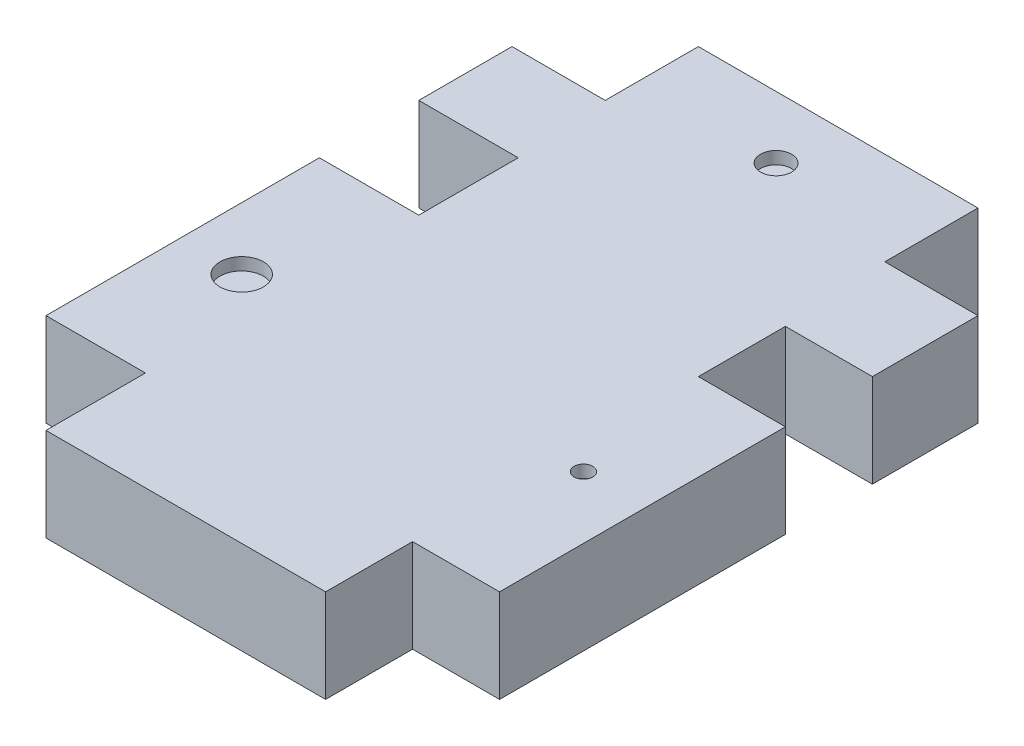
ISO-10303-21;
HEADER;
FILE_DESCRIPTION(('STEP AP214'),'2;1');
FILE_NAME('part.step','',(''),(''),'','','');
FILE_SCHEMA(('AUTOMOTIVE_DESIGN { 1 0 10303 214 1 1 1 1 }'));
ENDSEC;
DATA;
#1=APPLICATION_CONTEXT('core data for automotive mechanical design processes');
#2=APPLICATION_PROTOCOL_DEFINITION('international standard','automotive_design',2000,#1);
#3=PRODUCT_CONTEXT('',#1,'mechanical');
#4=PRODUCT('Part','Part','',(#3));
#5=PRODUCT_RELATED_PRODUCT_CATEGORY('part','',(#4));
#6=PRODUCT_DEFINITION_FORMATION('','',#4);
#7=PRODUCT_DEFINITION_CONTEXT('part definition',#1,'design');
#8=PRODUCT_DEFINITION('design','',#6,#7);
#9=PRODUCT_DEFINITION_SHAPE('','',#8);
#10=(LENGTH_UNIT() NAMED_UNIT(*) SI_UNIT(.MILLI.,.METRE.));
#11=(NAMED_UNIT(*) PLANE_ANGLE_UNIT() SI_UNIT($,.RADIAN.));
#12=(NAMED_UNIT(*) SI_UNIT($,.STERADIAN.) SOLID_ANGLE_UNIT());
#13=UNCERTAINTY_MEASURE_WITH_UNIT(LENGTH_MEASURE(1.E-05),#10,'distance_accuracy_value','');
#14=(GEOMETRIC_REPRESENTATION_CONTEXT(3) GLOBAL_UNCERTAINTY_ASSIGNED_CONTEXT((#13)) GLOBAL_UNIT_ASSIGNED_CONTEXT((#10,
#11,#12)) REPRESENTATION_CONTEXT('',''));
#15=CARTESIAN_POINT('',(0.,0.,0.));
#16=DIRECTION('',(0.,0.,1.));
#17=DIRECTION('',(1.,0.,0.));
#18=AXIS2_PLACEMENT_3D('',#15,#16,#17);
#19=CARTESIAN_POINT('',(0.,19.05,-8.89));
#20=DIRECTION('',(0.,0.,1.));
#21=DIRECTION('',(1.,0.,0.));
#22=AXIS2_PLACEMENT_3D('',#19,#20,#21);
#23=PLANE('',#22);
#24=DIRECTION('',(-1.,0.,0.));
#25=VECTOR('',#24,1.);
#26=CARTESIAN_POINT('',(0.,0.,-8.89));
#27=LINE('',#26,#25);
#28=CARTESIAN_POINT('',(9.52500000000002,0.,-8.89));
#29=VERTEX_POINT('',#28);
#30=CARTESIAN_POINT('',(-8.25499999999997,0.,-8.89));
#31=VERTEX_POINT('',#30);
#32=EDGE_CURVE('E210',#29,#31,#27,.T.);
#33=ORIENTED_EDGE('',*,*,#32,.T.);
#34=DIRECTION('',(0.,-1.,0.));
#35=VECTOR('',#34,1.);
#36=CARTESIAN_POINT('',(-8.25499999999997,19.05,-8.89));
#37=LINE('',#36,#35);
#38=CARTESIAN_POINT('',(-8.25499999999997,19.05,-8.89));
#39=VERTEX_POINT('',#38);
#40=EDGE_CURVE('E11',#39,#31,#37,.T.);
#41=ORIENTED_EDGE('',*,*,#40,.F.);
#42=DIRECTION('',(-1.,0.,0.));
#43=VECTOR('',#42,1.);
#44=CARTESIAN_POINT('',(0.,19.05,-8.89));
#45=LINE('',#44,#43);
#46=CARTESIAN_POINT('',(9.52500000000002,19.05,-8.89));
#47=VERTEX_POINT('',#46);
#48=EDGE_CURVE('E314',#47,#39,#45,.T.);
#49=ORIENTED_EDGE('',*,*,#48,.F.);
#50=DIRECTION('',(0.,-1.,0.));
#51=VECTOR('',#50,1.);
#52=CARTESIAN_POINT('',(9.52500000000002,19.05,-8.89));
#53=LINE('',#52,#51);
#54=EDGE_CURVE('E205',#47,#29,#53,.T.);
#55=ORIENTED_EDGE('',*,*,#54,.T.);
#56=EDGE_LOOP('',(#33,#41,#49,#55));
#57=FACE_BOUND('',#56,.T.);
#58=ADVANCED_FACE('F41',(#57),#23,.F.);
#59=CARTESIAN_POINT('',(-8.25499999999996,19.05,0.));
#60=DIRECTION('',(-1.,0.,0.));
#61=DIRECTION('',(0.,0.,1.));
#62=AXIS2_PLACEMENT_3D('',#59,#60,#61);
#63=PLANE('',#62);
#64=DIRECTION('',(0.,0.,-1.));
#65=VECTOR('',#64,1.);
#66=CARTESIAN_POINT('',(-8.25499999999996,0.,0.));
#67=LINE('',#66,#65);
#68=CARTESIAN_POINT('',(-8.25499999999998,0.,-26.67));
#69=VERTEX_POINT('',#68);
#70=EDGE_CURVE('E213',#31,#69,#67,.T.);
#71=ORIENTED_EDGE('',*,*,#70,.T.);
#72=DIRECTION('',(0.,-1.,0.));
#73=VECTOR('',#72,1.);
#74=CARTESIAN_POINT('',(-8.25499999999998,19.05,-26.67));
#75=LINE('',#74,#73);
#76=CARTESIAN_POINT('',(-8.25499999999998,19.05,-26.67));
#77=VERTEX_POINT('',#76);
#78=EDGE_CURVE('E49',#77,#69,#75,.T.);
#79=ORIENTED_EDGE('',*,*,#78,.F.);
#80=DIRECTION('',(0.,0.,-1.));
#81=VECTOR('',#80,1.);
#82=CARTESIAN_POINT('',(-8.25499999999996,19.05,0.));
#83=LINE('',#82,#81);
#84=EDGE_CURVE('E132',#39,#77,#83,.T.);
#85=ORIENTED_EDGE('',*,*,#84,.F.);
#86=ORIENTED_EDGE('',*,*,#40,.T.);
#87=EDGE_LOOP('',(#71,#79,#85,#86));
#88=FACE_BOUND('',#87,.T.);
#89=ADVANCED_FACE('F299',(#88),#63,.F.);
#90=CARTESIAN_POINT('',(0.,19.05,-26.67));
#91=DIRECTION('',(0.,0.,1.));
#92=DIRECTION('',(1.,0.,0.));
#93=AXIS2_PLACEMENT_3D('',#90,#91,#92);
#94=PLANE('',#93);
#95=DIRECTION('',(-1.,0.,0.));
#96=VECTOR('',#95,1.);
#97=CARTESIAN_POINT('',(0.,0.,-26.67));
#98=LINE('',#97,#96);
#99=CARTESIAN_POINT('',(9.52500000000001,0.,-26.67));
#100=VERTEX_POINT('',#99);
#101=EDGE_CURVE('E217',#100,#69,#98,.T.);
#102=ORIENTED_EDGE('',*,*,#101,.F.);
#103=DIRECTION('',(0.,-1.,0.));
#104=VECTOR('',#103,1.);
#105=CARTESIAN_POINT('',(9.52500000000001,19.05,-26.67));
#106=LINE('',#105,#104);
#107=CARTESIAN_POINT('',(9.52500000000001,19.05,-26.67));
#108=VERTEX_POINT('',#107);
#109=EDGE_CURVE('E292',#108,#100,#106,.T.);
#110=ORIENTED_EDGE('',*,*,#109,.F.);
#111=DIRECTION('',(-1.,0.,0.));
#112=VECTOR('',#111,1.);
#113=CARTESIAN_POINT('',(0.,19.05,-26.67));
#114=LINE('',#113,#112);
#115=EDGE_CURVE('E298',#108,#77,#114,.T.);
#116=ORIENTED_EDGE('',*,*,#115,.T.);
#117=ORIENTED_EDGE('',*,*,#78,.T.);
#118=EDGE_LOOP('',(#102,#110,#116,#117));
#119=FACE_BOUND('',#118,.T.);
#120=ADVANCED_FACE('F296',(#119),#94,.T.);
#121=CARTESIAN_POINT('',(9.52500000000002,19.05,0.));
#122=DIRECTION('',(-1.,0.,0.));
#123=DIRECTION('',(0.,0.,1.));
#124=AXIS2_PLACEMENT_3D('',#121,#122,#123);
#125=PLANE('',#124);
#126=DIRECTION('',(0.,0.,-1.));
#127=VECTOR('',#126,1.);
#128=CARTESIAN_POINT('',(9.52500000000002,0.,0.));
#129=LINE('',#128,#127);
#130=CARTESIAN_POINT('',(9.52500000000001,0.,-48.26));
#131=VERTEX_POINT('',#130);
#132=EDGE_CURVE('E220',#100,#131,#129,.T.);
#133=ORIENTED_EDGE('',*,*,#132,.T.);
#134=DIRECTION('',(0.,-1.,0.));
#135=VECTOR('',#134,1.);
#136=CARTESIAN_POINT('',(9.52500000000001,19.05,-48.26));
#137=LINE('',#136,#135);
#138=CARTESIAN_POINT('',(9.52500000000001,19.05,-48.26));
#139=VERTEX_POINT('',#138);
#140=EDGE_CURVE('E290',#139,#131,#137,.T.);
#141=ORIENTED_EDGE('',*,*,#140,.F.);
#142=DIRECTION('',(0.,0.,-1.));
#143=VECTOR('',#142,1.);
#144=CARTESIAN_POINT('',(9.52500000000002,19.05,0.));
#145=LINE('',#144,#143);
#146=EDGE_CURVE('E207',#108,#139,#145,.T.);
#147=ORIENTED_EDGE('',*,*,#146,.F.);
#148=ORIENTED_EDGE('',*,*,#109,.T.);
#149=EDGE_LOOP('',(#133,#141,#147,#148));
#150=FACE_BOUND('',#149,.T.);
#151=ADVANCED_FACE('F308',(#150),#125,.F.);
#152=CARTESIAN_POINT('',(0.,19.05,-48.26));
#153=DIRECTION('',(0.,0.,-1.));
#154=DIRECTION('',(-1.,0.,0.));
#155=AXIS2_PLACEMENT_3D('',#152,#153,#154);
#156=PLANE('',#155);
#157=DIRECTION('',(1.,0.,0.));
#158=VECTOR('',#157,1.);
#159=CARTESIAN_POINT('',(0.,0.,-48.26));
#160=LINE('',#159,#158);
#161=CARTESIAN_POINT('',(-9.525,0.,-48.26));
#162=VERTEX_POINT('',#161);
#163=EDGE_CURVE('E223',#162,#131,#160,.T.);
#164=ORIENTED_EDGE('',*,*,#163,.F.);
#165=DIRECTION('',(0.,-1.,0.));
#166=VECTOR('',#165,1.);
#167=CARTESIAN_POINT('',(-9.525,19.05,-48.26));
#168=LINE('',#167,#166);
#169=CARTESIAN_POINT('',(-9.525,19.05,-48.26));
#170=VERTEX_POINT('',#169);
#171=EDGE_CURVE('E288',#170,#162,#168,.T.);
#172=ORIENTED_EDGE('',*,*,#171,.F.);
#173=DIRECTION('',(1.,0.,0.));
#174=VECTOR('',#173,1.);
#175=CARTESIAN_POINT('',(0.,19.05,-48.26));
#176=LINE('',#175,#174);
#177=EDGE_CURVE('E312',#170,#139,#176,.T.);
#178=ORIENTED_EDGE('',*,*,#177,.T.);
#179=ORIENTED_EDGE('',*,*,#140,.T.);
#180=EDGE_LOOP('',(#164,#172,#178,#179));
#181=FACE_BOUND('',#180,.T.);
#182=ADVANCED_FACE('F594',(#181),#156,.T.);
#183=CARTESIAN_POINT('',(-9.525,19.05,0.));
#184=DIRECTION('',(1.,0.,0.));
#185=DIRECTION('',(0.,0.,-1.));
#186=AXIS2_PLACEMENT_3D('',#183,#184,#185);
#187=PLANE('',#186);
#188=DIRECTION('',(0.,0.,1.));
#189=VECTOR('',#188,1.);
#190=CARTESIAN_POINT('',(-9.525,0.,0.));
#191=LINE('',#190,#189);
#192=CARTESIAN_POINT('',(-9.525,0.,-67.31));
#193=VERTEX_POINT('',#192);
#194=EDGE_CURVE('E226',#193,#162,#191,.T.);
#195=ORIENTED_EDGE('',*,*,#194,.F.);
#196=DIRECTION('',(0.,-1.,0.));
#197=VECTOR('',#196,1.);
#198=CARTESIAN_POINT('',(-9.525,19.05,-67.31));
#199=LINE('',#198,#197);
#200=CARTESIAN_POINT('',(-9.525,19.05,-67.31));
#201=VERTEX_POINT('',#200);
#202=EDGE_CURVE('E286',#201,#193,#199,.T.);
#203=ORIENTED_EDGE('',*,*,#202,.F.);
#204=DIRECTION('',(0.,0.,1.));
#205=VECTOR('',#204,1.);
#206=CARTESIAN_POINT('',(-9.525,19.05,0.));
#207=LINE('',#206,#205);
#208=EDGE_CURVE('E319',#201,#170,#207,.T.);
#209=ORIENTED_EDGE('',*,*,#208,.T.);
#210=ORIENTED_EDGE('',*,*,#171,.T.);
#211=EDGE_LOOP('',(#195,#203,#209,#210));
#212=FACE_BOUND('',#211,.T.);
#213=ADVANCED_FACE('F585',(#212),#187,.T.);
#214=CARTESIAN_POINT('',(0.,19.05,-67.31));
#215=DIRECTION('',(0.,0.,1.));
#216=DIRECTION('',(1.,0.,0.));
#217=AXIS2_PLACEMENT_3D('',#214,#215,#216);
#218=PLANE('',#217);
#219=DIRECTION('',(-1.,0.,0.));
#220=VECTOR('',#219,1.);
#221=CARTESIAN_POINT('',(0.,0.,-67.31));
#222=LINE('',#221,#220);
#223=CARTESIAN_POINT('',(-66.675,0.,-67.31));
#224=VERTEX_POINT('',#223);
#225=EDGE_CURVE('E229',#193,#224,#222,.T.);
#226=ORIENTED_EDGE('',*,*,#225,.T.);
#227=DIRECTION('',(0.,-1.,0.));
#228=VECTOR('',#227,1.);
#229=CARTESIAN_POINT('',(-66.675,19.05,-67.31));
#230=LINE('',#229,#228);
#231=CARTESIAN_POINT('',(-66.675,19.05,-67.31));
#232=VERTEX_POINT('',#231);
#233=EDGE_CURVE('E283',#232,#224,#230,.T.);
#234=ORIENTED_EDGE('',*,*,#233,.F.);
#235=DIRECTION('',(-1.,0.,0.));
#236=VECTOR('',#235,1.);
#237=CARTESIAN_POINT('',(0.,19.05,-67.31));
#238=LINE('',#237,#236);
#239=EDGE_CURVE('E322',#201,#232,#238,.T.);
#240=ORIENTED_EDGE('',*,*,#239,.F.);
#241=ORIENTED_EDGE('',*,*,#202,.T.);
#242=EDGE_LOOP('',(#226,#234,#240,#241));
#243=FACE_BOUND('',#242,.T.);
#244=ADVANCED_FACE('F576',(#243),#218,.F.);
#245=CARTESIAN_POINT('',(-66.675,19.05,0.));
#246=DIRECTION('',(1.,0.,0.));
#247=DIRECTION('',(0.,0.,-1.));
#248=AXIS2_PLACEMENT_3D('',#245,#246,#247);
#249=PLANE('',#248);
#250=DIRECTION('',(0.,0.,1.));
#251=VECTOR('',#250,1.);
#252=CARTESIAN_POINT('',(-66.675,0.,0.));
#253=LINE('',#252,#251);
#254=CARTESIAN_POINT('',(-66.675,0.,-48.26));
#255=VERTEX_POINT('',#254);
#256=EDGE_CURVE('E231',#224,#255,#253,.T.);
#257=ORIENTED_EDGE('',*,*,#256,.T.);
#258=DIRECTION('',(0.,-1.,0.));
#259=VECTOR('',#258,1.);
#260=CARTESIAN_POINT('',(-66.675,19.05,-48.26));
#261=LINE('',#260,#259);
#262=CARTESIAN_POINT('',(-66.675,19.05,-48.26));
#263=VERTEX_POINT('',#262);
#264=EDGE_CURVE('E281',#263,#255,#261,.T.);
#265=ORIENTED_EDGE('',*,*,#264,.F.);
#266=DIRECTION('',(0.,0.,1.));
#267=VECTOR('',#266,1.);
#268=CARTESIAN_POINT('',(-66.675,19.05,0.));
#269=LINE('',#268,#267);
#270=EDGE_CURVE('E324',#232,#263,#269,.T.);
#271=ORIENTED_EDGE('',*,*,#270,.F.);
#272=ORIENTED_EDGE('',*,*,#233,.T.);
#273=EDGE_LOOP('',(#257,#265,#271,#272));
#274=FACE_BOUND('',#273,.T.);
#275=ADVANCED_FACE('F567',(#274),#249,.F.);
#276=CARTESIAN_POINT('',(0.,19.05,-48.26));
#277=DIRECTION('',(0.,0.,-1.));
#278=DIRECTION('',(-1.,0.,0.));
#279=AXIS2_PLACEMENT_3D('',#276,#277,#278);
#280=PLANE('',#279);
#281=DIRECTION('',(1.,0.,0.));
#282=VECTOR('',#281,1.);
#283=CARTESIAN_POINT('',(0.,0.,-48.26));
#284=LINE('',#283,#282);
#285=CARTESIAN_POINT('',(-85.725,0.,-48.26));
#286=VERTEX_POINT('',#285);
#287=EDGE_CURVE('E234',#286,#255,#284,.T.);
#288=ORIENTED_EDGE('',*,*,#287,.F.);
#289=DIRECTION('',(0.,-1.,0.));
#290=VECTOR('',#289,1.);
#291=CARTESIAN_POINT('',(-85.725,19.05,-48.26));
#292=LINE('',#291,#290);
#293=CARTESIAN_POINT('',(-85.725,19.05,-48.26));
#294=VERTEX_POINT('',#293);
#295=EDGE_CURVE('E279',#294,#286,#292,.T.);
#296=ORIENTED_EDGE('',*,*,#295,.F.);
#297=DIRECTION('',(1.,0.,0.));
#298=VECTOR('',#297,1.);
#299=CARTESIAN_POINT('',(0.,19.05,-48.26));
#300=LINE('',#299,#298);
#301=EDGE_CURVE('E326',#294,#263,#300,.T.);
#302=ORIENTED_EDGE('',*,*,#301,.T.);
#303=ORIENTED_EDGE('',*,*,#264,.T.);
#304=EDGE_LOOP('',(#288,#296,#302,#303));
#305=FACE_BOUND('',#304,.T.);
#306=ADVANCED_FACE('F559',(#305),#280,.T.);
#307=CARTESIAN_POINT('',(-85.725,19.05,0.));
#308=DIRECTION('',(1.,0.,0.));
#309=DIRECTION('',(0.,0.,-1.));
#310=AXIS2_PLACEMENT_3D('',#307,#308,#309);
#311=PLANE('',#310);
#312=DIRECTION('',(0.,0.,1.));
#313=VECTOR('',#312,1.);
#314=CARTESIAN_POINT('',(-85.725,0.,0.));
#315=LINE('',#314,#313);
#316=CARTESIAN_POINT('',(-85.725,0.,-29.21));
#317=VERTEX_POINT('',#316);
#318=EDGE_CURVE('E237',#286,#317,#315,.T.);
#319=ORIENTED_EDGE('',*,*,#318,.T.);
#320=DIRECTION('',(0.,-1.,0.));
#321=VECTOR('',#320,1.);
#322=CARTESIAN_POINT('',(-85.725,19.05,-29.21));
#323=LINE('',#322,#321);
#324=CARTESIAN_POINT('',(-85.725,19.05,-29.21));
#325=VERTEX_POINT('',#324);
#326=EDGE_CURVE('E276',#325,#317,#323,.T.);
#327=ORIENTED_EDGE('',*,*,#326,.F.);
#328=DIRECTION('',(0.,0.,1.));
#329=VECTOR('',#328,1.);
#330=CARTESIAN_POINT('',(-85.725,19.05,0.));
#331=LINE('',#330,#329);
#332=EDGE_CURVE('E329',#294,#325,#331,.T.);
#333=ORIENTED_EDGE('',*,*,#332,.F.);
#334=ORIENTED_EDGE('',*,*,#295,.T.);
#335=EDGE_LOOP('',(#319,#327,#333,#334));
#336=FACE_BOUND('',#335,.T.);
#337=ADVANCED_FACE('F526',(#336),#311,.F.);
#338=CARTESIAN_POINT('',(0.,19.05,-29.21));
#339=DIRECTION('',(0.,0.,-1.));
#340=DIRECTION('',(-1.,0.,0.));
#341=AXIS2_PLACEMENT_3D('',#338,#339,#340);
#342=PLANE('',#341);
#343=DIRECTION('',(1.,0.,0.));
#344=VECTOR('',#343,1.);
#345=CARTESIAN_POINT('',(0.,0.,-29.21));
#346=LINE('',#345,#344);
#347=CARTESIAN_POINT('',(-65.405,0.,-29.21));
#348=VERTEX_POINT('',#347);
#349=EDGE_CURVE('E239',#317,#348,#346,.T.);
#350=ORIENTED_EDGE('',*,*,#349,.T.);
#351=DIRECTION('',(0.,-1.,0.));
#352=VECTOR('',#351,1.);
#353=CARTESIAN_POINT('',(-65.405,19.05,-29.21));
#354=LINE('',#353,#352);
#355=CARTESIAN_POINT('',(-65.405,19.05,-29.21));
#356=VERTEX_POINT('',#355);
#357=EDGE_CURVE('E274',#356,#348,#354,.T.);
#358=ORIENTED_EDGE('',*,*,#357,.F.);
#359=DIRECTION('',(1.,0.,0.));
#360=VECTOR('',#359,1.);
#361=CARTESIAN_POINT('',(0.,19.05,-29.21));
#362=LINE('',#361,#360);
#363=EDGE_CURVE('E331',#325,#356,#362,.T.);
#364=ORIENTED_EDGE('',*,*,#363,.F.);
#365=ORIENTED_EDGE('',*,*,#326,.T.);
#366=EDGE_LOOP('',(#350,#358,#364,#365));
#367=FACE_BOUND('',#366,.T.);
#368=ADVANCED_FACE('F542',(#367),#342,.F.);
#369=CARTESIAN_POINT('',(-65.405,19.05,0.));
#370=DIRECTION('',(-1.,0.,0.));
#371=DIRECTION('',(0.,0.,1.));
#372=AXIS2_PLACEMENT_3D('',#369,#370,#371);
#373=PLANE('',#372);
#374=DIRECTION('',(0.,0.,-1.));
#375=VECTOR('',#374,1.);
#376=CARTESIAN_POINT('',(-65.405,0.,0.));
#377=LINE('',#376,#375);
#378=CARTESIAN_POINT('',(-65.405,0.,-8.89));
#379=VERTEX_POINT('',#378);
#380=EDGE_CURVE('E243',#379,#348,#377,.T.);
#381=ORIENTED_EDGE('',*,*,#380,.F.);
#382=DIRECTION('',(0.,-1.,0.));
#383=VECTOR('',#382,1.);
#384=CARTESIAN_POINT('',(-65.405,19.05,-8.89));
#385=LINE('',#384,#383);
#386=CARTESIAN_POINT('',(-65.405,19.05,-8.89));
#387=VERTEX_POINT('',#386);
#388=EDGE_CURVE('E272',#387,#379,#385,.T.);
#389=ORIENTED_EDGE('',*,*,#388,.F.);
#390=DIRECTION('',(0.,0.,-1.));
#391=VECTOR('',#390,1.);
#392=CARTESIAN_POINT('',(-65.405,19.05,0.));
#393=LINE('',#392,#391);
#394=EDGE_CURVE('E334',#387,#356,#393,.T.);
#395=ORIENTED_EDGE('',*,*,#394,.T.);
#396=ORIENTED_EDGE('',*,*,#357,.T.);
#397=EDGE_LOOP('',(#381,#389,#395,#396));
#398=FACE_BOUND('',#397,.T.);
#399=ADVANCED_FACE('F533',(#398),#373,.T.);
#400=CARTESIAN_POINT('',(0.,19.05,-8.89));
#401=DIRECTION('',(0.,0.,-1.));
#402=DIRECTION('',(-1.,0.,0.));
#403=AXIS2_PLACEMENT_3D('',#400,#401,#402);
#404=PLANE('',#403);
#405=DIRECTION('',(1.,0.,0.));
#406=VECTOR('',#405,1.);
#407=CARTESIAN_POINT('',(0.,0.,-8.89));
#408=LINE('',#407,#406);
#409=CARTESIAN_POINT('',(-85.725,0.,-8.89));
#410=VERTEX_POINT('',#409);
#411=EDGE_CURVE('E246',#410,#379,#408,.T.);
#412=ORIENTED_EDGE('',*,*,#411,.F.);
#413=DIRECTION('',(0.,-1.,0.));
#414=VECTOR('',#413,1.);
#415=CARTESIAN_POINT('',(-85.725,19.05,-8.89));
#416=LINE('',#415,#414);
#417=CARTESIAN_POINT('',(-85.725,19.05,-8.89));
#418=VERTEX_POINT('',#417);
#419=EDGE_CURVE('E270',#418,#410,#416,.T.);
#420=ORIENTED_EDGE('',*,*,#419,.F.);
#421=DIRECTION('',(1.,0.,0.));
#422=VECTOR('',#421,1.);
#423=CARTESIAN_POINT('',(0.,19.05,-8.89));
#424=LINE('',#423,#422);
#425=EDGE_CURVE('E337',#418,#387,#424,.T.);
#426=ORIENTED_EDGE('',*,*,#425,.T.);
#427=ORIENTED_EDGE('',*,*,#388,.T.);
#428=EDGE_LOOP('',(#412,#420,#426,#427));
#429=FACE_BOUND('',#428,.T.);
#430=ADVANCED_FACE('F523',(#429),#404,.T.);
#431=CARTESIAN_POINT('',(-85.725,0.,46.99));
#432=VERTEX_POINT('',#431);
#433=EDGE_CURVE('E240',#410,#432,#315,.T.);
#434=ORIENTED_EDGE('',*,*,#433,.T.);
#435=DIRECTION('',(0.,-1.,0.));
#436=VECTOR('',#435,1.);
#437=CARTESIAN_POINT('',(-85.725,19.05,46.99));
#438=LINE('',#437,#436);
#439=CARTESIAN_POINT('',(-85.725,19.05,46.99));
#440=VERTEX_POINT('',#439);
#441=EDGE_CURVE('E267',#440,#432,#438,.T.);
#442=ORIENTED_EDGE('',*,*,#441,.F.);
#443=EDGE_CURVE('E332',#418,#440,#331,.T.);
#444=ORIENTED_EDGE('',*,*,#443,.F.);
#445=ORIENTED_EDGE('',*,*,#419,.T.);
#446=EDGE_LOOP('',(#434,#442,#444,#445));
#447=FACE_BOUND('',#446,.T.);
#448=ADVANCED_FACE('F515',(#447),#311,.F.);
#449=CARTESIAN_POINT('',(0.,19.05,46.99));
#450=DIRECTION('',(0.,0.,-1.));
#451=DIRECTION('',(-1.,0.,0.));
#452=AXIS2_PLACEMENT_3D('',#449,#450,#451);
#453=PLANE('',#452);
#454=DIRECTION('',(1.,0.,0.));
#455=VECTOR('',#454,1.);
#456=CARTESIAN_POINT('',(0.,0.,46.99));
#457=LINE('',#456,#455);
#458=CARTESIAN_POINT('',(-65.405,0.,46.99));
#459=VERTEX_POINT('',#458);
#460=EDGE_CURVE('E249',#432,#459,#457,.T.);
#461=ORIENTED_EDGE('',*,*,#460,.T.);
#462=DIRECTION('',(0.,-1.,0.));
#463=VECTOR('',#462,1.);
#464=CARTESIAN_POINT('',(-65.405,19.05,46.99));
#465=LINE('',#464,#463);
#466=CARTESIAN_POINT('',(-65.405,19.05,46.99));
#467=VERTEX_POINT('',#466);
#468=EDGE_CURVE('E265',#467,#459,#465,.T.);
#469=ORIENTED_EDGE('',*,*,#468,.F.);
#470=DIRECTION('',(1.,0.,0.));
#471=VECTOR('',#470,1.);
#472=CARTESIAN_POINT('',(0.,19.05,46.99));
#473=LINE('',#472,#471);
#474=EDGE_CURVE('E340',#440,#467,#473,.T.);
#475=ORIENTED_EDGE('',*,*,#474,.F.);
#476=ORIENTED_EDGE('',*,*,#441,.T.);
#477=EDGE_LOOP('',(#461,#469,#475,#476));
#478=FACE_BOUND('',#477,.T.);
#479=ADVANCED_FACE('F353',(#478),#453,.F.);
#480=CARTESIAN_POINT('',(-65.4049999999999,19.05,0.));
#481=DIRECTION('',(-1.,0.,0.));
#482=DIRECTION('',(0.,0.,1.));
#483=AXIS2_PLACEMENT_3D('',#480,#481,#482);
#484=PLANE('',#483);
#485=DIRECTION('',(0.,0.,-1.));
#486=VECTOR('',#485,1.);
#487=CARTESIAN_POINT('',(-65.4049999999999,0.,0.));
#488=LINE('',#487,#486);
#489=CARTESIAN_POINT('',(-65.405,0.,67.31));
#490=VERTEX_POINT('',#489);
#491=EDGE_CURVE('E252',#490,#459,#488,.T.);
#492=ORIENTED_EDGE('',*,*,#491,.F.);
#493=DIRECTION('',(0.,-1.,0.));
#494=VECTOR('',#493,1.);
#495=CARTESIAN_POINT('',(-65.405,19.05,67.31));
#496=LINE('',#495,#494);
#497=CARTESIAN_POINT('',(-65.405,19.05,67.31));
#498=VERTEX_POINT('',#497);
#499=EDGE_CURVE('E263',#498,#490,#496,.T.);
#500=ORIENTED_EDGE('',*,*,#499,.F.);
#501=DIRECTION('',(0.,0.,-1.));
#502=VECTOR('',#501,1.);
#503=CARTESIAN_POINT('',(-65.4049999999999,19.05,0.));
#504=LINE('',#503,#502);
#505=EDGE_CURVE('E342',#498,#467,#504,.T.);
#506=ORIENTED_EDGE('',*,*,#505,.T.);
#507=ORIENTED_EDGE('',*,*,#468,.T.);
#508=EDGE_LOOP('',(#492,#500,#506,#507));
#509=FACE_BOUND('',#508,.T.);
#510=ADVANCED_FACE('F346',(#509),#484,.T.);
#511=CARTESIAN_POINT('',(0.,19.05,67.31));
#512=DIRECTION('',(0.,0.,-1.));
#513=DIRECTION('',(-1.,0.,0.));
#514=AXIS2_PLACEMENT_3D('',#511,#512,#513);
#515=PLANE('',#514);
#516=DIRECTION('',(1.,0.,0.));
#517=VECTOR('',#516,1.);
#518=CARTESIAN_POINT('',(0.,0.,67.31));
#519=LINE('',#518,#517);
#520=CARTESIAN_POINT('',(-8.25499999999997,0.,67.31));
#521=VERTEX_POINT('',#520);
#522=EDGE_CURVE('E255',#490,#521,#519,.T.);
#523=ORIENTED_EDGE('',*,*,#522,.T.);
#524=DIRECTION('',(0.,-1.,0.));
#525=VECTOR('',#524,1.);
#526=CARTESIAN_POINT('',(-8.25499999999997,19.05,67.31));
#527=LINE('',#526,#525);
#528=CARTESIAN_POINT('',(-8.25499999999997,19.05,67.31));
#529=VERTEX_POINT('',#528);
#530=EDGE_CURVE('E201',#529,#521,#527,.T.);
#531=ORIENTED_EDGE('',*,*,#530,.F.);
#532=DIRECTION('',(1.,0.,0.));
#533=VECTOR('',#532,1.);
#534=CARTESIAN_POINT('',(0.,19.05,67.31));
#535=LINE('',#534,#533);
#536=EDGE_CURVE('E188',#498,#529,#535,.T.);
#537=ORIENTED_EDGE('',*,*,#536,.F.);
#538=ORIENTED_EDGE('',*,*,#499,.T.);
#539=EDGE_LOOP('',(#523,#531,#537,#538));
#540=FACE_BOUND('',#539,.T.);
#541=ADVANCED_FACE('F358',(#540),#515,.F.);
#542=CARTESIAN_POINT('',(-8.25499999999995,19.05,0.));
#543=DIRECTION('',(-1.,0.,0.));
#544=DIRECTION('',(0.,0.,1.));
#545=AXIS2_PLACEMENT_3D('',#542,#543,#544);
#546=PLANE('',#545);
#547=DIRECTION('',(0.,0.,-1.));
#548=VECTOR('',#547,1.);
#549=CARTESIAN_POINT('',(-8.25499999999995,0.,0.));
#550=LINE('',#549,#548);
#551=CARTESIAN_POINT('',(-8.25499999999996,0.,49.53));
#552=VERTEX_POINT('',#551);
#553=EDGE_CURVE('E197',#521,#552,#550,.T.);
#554=ORIENTED_EDGE('',*,*,#553,.T.);
#555=DIRECTION('',(0.,-1.,0.));
#556=VECTOR('',#555,1.);
#557=CARTESIAN_POINT('',(-8.25499999999996,19.05,49.53));
#558=LINE('',#557,#556);
#559=CARTESIAN_POINT('',(-8.25499999999996,19.05,49.53));
#560=VERTEX_POINT('',#559);
#561=EDGE_CURVE('E194',#560,#552,#558,.T.);
#562=ORIENTED_EDGE('',*,*,#561,.F.);
#563=DIRECTION('',(0.,0.,-1.));
#564=VECTOR('',#563,1.);
#565=CARTESIAN_POINT('',(-8.25499999999995,19.05,0.));
#566=LINE('',#565,#564);
#567=EDGE_CURVE('E181',#529,#560,#566,.T.);
#568=ORIENTED_EDGE('',*,*,#567,.F.);
#569=ORIENTED_EDGE('',*,*,#530,.T.);
#570=EDGE_LOOP('',(#554,#562,#568,#569));
#571=FACE_BOUND('',#570,.T.);
#572=ADVANCED_FACE('F195',(#571),#546,.F.);
#573=CARTESIAN_POINT('',(0.,19.05,49.53));
#574=DIRECTION('',(0.,0.,1.));
#575=DIRECTION('',(1.,0.,0.));
#576=AXIS2_PLACEMENT_3D('',#573,#574,#575);
#577=PLANE('',#576);
#578=DIRECTION('',(-1.,0.,0.));
#579=VECTOR('',#578,1.);
#580=CARTESIAN_POINT('',(0.,0.,49.53));
#581=LINE('',#580,#579);
#582=CARTESIAN_POINT('',(9.52500000000003,0.,49.53));
#583=VERTEX_POINT('',#582);
#584=EDGE_CURVE('E258',#583,#552,#581,.T.);
#585=ORIENTED_EDGE('',*,*,#584,.F.);
#586=DIRECTION('',(0.,-1.,0.));
#587=VECTOR('',#586,1.);
#588=CARTESIAN_POINT('',(9.52500000000003,19.05,49.53));
#589=LINE('',#588,#587);
#590=CARTESIAN_POINT('',(9.52500000000003,19.05,49.53));
#591=VERTEX_POINT('',#590);
#592=EDGE_CURVE('E121',#591,#583,#589,.T.);
#593=ORIENTED_EDGE('',*,*,#592,.F.);
#594=DIRECTION('',(-1.,0.,0.));
#595=VECTOR('',#594,1.);
#596=CARTESIAN_POINT('',(0.,19.05,49.53));
#597=LINE('',#596,#595);
#598=EDGE_CURVE('E185',#591,#560,#597,.T.);
#599=ORIENTED_EDGE('',*,*,#598,.T.);
#600=ORIENTED_EDGE('',*,*,#561,.T.);
#601=EDGE_LOOP('',(#585,#593,#599,#600));
#602=FACE_BOUND('',#601,.T.);
#603=ADVANCED_FACE('F203',(#602),#577,.T.);
#604=EDGE_CURVE('E124',#583,#29,#129,.T.);
#605=ORIENTED_EDGE('',*,*,#604,.T.);
#606=ORIENTED_EDGE('',*,*,#54,.F.);
#607=EDGE_CURVE('E57',#591,#47,#145,.T.);
#608=ORIENTED_EDGE('',*,*,#607,.F.);
#609=ORIENTED_EDGE('',*,*,#592,.T.);
#610=EDGE_LOOP('',(#605,#606,#608,#609));
#611=FACE_BOUND('',#610,.T.);
#612=ADVANCED_FACE('F403',(#611),#125,.F.);
#613=CARTESIAN_POINT('',(0.,19.05,0.));
#614=DIRECTION('',(0.,1.,0.));
#615=DIRECTION('',(0.,0.,1.));
#616=AXIS2_PLACEMENT_3D('',#613,#614,#615);
#617=PLANE('',#616);
#618=CARTESIAN_POINT('',(-3.17499999999997,19.05,19.685));
#619=DIRECTION('',(0.,1.,0.));
#620=DIRECTION('',(0.,0.,1.));
#621=AXIS2_PLACEMENT_3D('',#618,#619,#620);
#622=CIRCLE('',#621,1.905);
#623=CARTESIAN_POINT('',(-3.17499999999997,19.05,21.59));
#624=VERTEX_POINT('',#623);
#625=EDGE_CURVE('E386',#624,#624,#622,.T.);
#626=ORIENTED_EDGE('',*,*,#625,.F.);
#627=EDGE_LOOP('',(#626));
#628=FACE_BOUND('',#627,.T.);
#629=CARTESIAN_POINT('',(-73.025,19.05,19.685));
#630=DIRECTION('',(0.,1.,0.));
#631=DIRECTION('',(0.,0.,1.));
#632=AXIS2_PLACEMENT_3D('',#629,#630,#631);
#633=CIRCLE('',#632,4.445);
#634=CARTESIAN_POINT('',(-73.025,19.05,24.13));
#635=VERTEX_POINT('',#634);
#636=EDGE_CURVE('E383',#635,#635,#633,.T.);
#637=ORIENTED_EDGE('',*,*,#636,.F.);
#638=EDGE_LOOP('',(#637));
#639=FACE_BOUND('',#638,.T.);
#640=CARTESIAN_POINT('',(-38.1,19.05,-54.61));
#641=DIRECTION('',(0.,1.,0.));
#642=DIRECTION('',(0.,0.,1.));
#643=AXIS2_PLACEMENT_3D('',#640,#641,#642);
#644=CIRCLE('',#643,3.175);
#645=CARTESIAN_POINT('',(-38.1,19.05,-51.435));
#646=VERTEX_POINT('',#645);
#647=EDGE_CURVE('E377',#646,#646,#644,.T.);
#648=ORIENTED_EDGE('',*,*,#647,.F.);
#649=EDGE_LOOP('',(#648));
#650=FACE_BOUND('',#649,.T.);
#651=ORIENTED_EDGE('',*,*,#48,.T.);
#652=ORIENTED_EDGE('',*,*,#84,.T.);
#653=ORIENTED_EDGE('',*,*,#115,.F.);
#654=ORIENTED_EDGE('',*,*,#146,.T.);
#655=ORIENTED_EDGE('',*,*,#177,.F.);
#656=ORIENTED_EDGE('',*,*,#208,.F.);
#657=ORIENTED_EDGE('',*,*,#239,.T.);
#658=ORIENTED_EDGE('',*,*,#270,.T.);
#659=ORIENTED_EDGE('',*,*,#301,.F.);
#660=ORIENTED_EDGE('',*,*,#332,.T.);
#661=ORIENTED_EDGE('',*,*,#363,.T.);
#662=ORIENTED_EDGE('',*,*,#394,.F.);
#663=ORIENTED_EDGE('',*,*,#425,.F.);
#664=ORIENTED_EDGE('',*,*,#443,.T.);
#665=ORIENTED_EDGE('',*,*,#474,.T.);
#666=ORIENTED_EDGE('',*,*,#505,.F.);
#667=ORIENTED_EDGE('',*,*,#536,.T.);
#668=ORIENTED_EDGE('',*,*,#567,.T.);
#669=ORIENTED_EDGE('',*,*,#598,.F.);
#670=ORIENTED_EDGE('',*,*,#607,.T.);
#671=EDGE_LOOP('',(#651,#652,#653,#654,#655,#656,#657,#658,#659,#660,#661,#662,#663,#664,#665,
#666,#667,#668,#669,#670));
#672=FACE_BOUND('',#671,.T.);
#673=ADVANCED_FACE('F183',(#628,#639,#650,#672),#617,.T.);
#674=CARTESIAN_POINT('',(0.,0.,0.));
#675=DIRECTION('',(0.,1.,0.));
#676=DIRECTION('',(0.,0.,1.));
#677=AXIS2_PLACEMENT_3D('',#674,#675,#676);
#678=PLANE('',#677);
#679=ORIENTED_EDGE('',*,*,#32,.F.);
#680=ORIENTED_EDGE('',*,*,#604,.F.);
#681=ORIENTED_EDGE('',*,*,#584,.T.);
#682=ORIENTED_EDGE('',*,*,#553,.F.);
#683=ORIENTED_EDGE('',*,*,#522,.F.);
#684=ORIENTED_EDGE('',*,*,#491,.T.);
#685=ORIENTED_EDGE('',*,*,#460,.F.);
#686=ORIENTED_EDGE('',*,*,#433,.F.);
#687=ORIENTED_EDGE('',*,*,#411,.T.);
#688=ORIENTED_EDGE('',*,*,#380,.T.);
#689=ORIENTED_EDGE('',*,*,#349,.F.);
#690=ORIENTED_EDGE('',*,*,#318,.F.);
#691=ORIENTED_EDGE('',*,*,#287,.T.);
#692=ORIENTED_EDGE('',*,*,#256,.F.);
#693=ORIENTED_EDGE('',*,*,#225,.F.);
#694=ORIENTED_EDGE('',*,*,#194,.T.);
#695=ORIENTED_EDGE('',*,*,#163,.T.);
#696=ORIENTED_EDGE('',*,*,#132,.F.);
#697=ORIENTED_EDGE('',*,*,#101,.T.);
#698=ORIENTED_EDGE('',*,*,#70,.F.);
#699=EDGE_LOOP('',(#679,#680,#681,#682,#683,#684,#685,#686,#687,#688,#689,#690,#691,#692,#693,
#694,#695,#696,#697,#698));
#700=FACE_BOUND('',#699,.T.);
#701=ADVANCED_FACE('F304',(#700),#678,.F.);
#702=CARTESIAN_POINT('',(-38.1,16.51,-54.61));
#703=DIRECTION('',(0.,1.,0.));
#704=DIRECTION('',(0.,0.,1.));
#705=AXIS2_PLACEMENT_3D('',#702,#703,#704);
#706=CYLINDRICAL_SURFACE('',#705,3.175);
#707=CARTESIAN_POINT('',(-38.1,16.51,-54.61));
#708=DIRECTION('',(0.,1.,0.));
#709=DIRECTION('',(0.,0.,1.));
#710=AXIS2_PLACEMENT_3D('',#707,#708,#709);
#711=CIRCLE('',#710,3.175);
#712=CARTESIAN_POINT('',(-38.1,16.51,-51.435));
#713=VERTEX_POINT('',#712);
#714=EDGE_CURVE('E374',#713,#713,#711,.T.);
#715=ORIENTED_EDGE('',*,*,#714,.F.);
#716=EDGE_LOOP('',(#715));
#717=FACE_BOUND('',#716,.T.);
#718=ORIENTED_EDGE('',*,*,#647,.T.);
#719=EDGE_LOOP('',(#718));
#720=FACE_BOUND('',#719,.T.);
#721=ADVANCED_FACE('F409',(#717,#720),#706,.F.);
#722=CARTESIAN_POINT('',(-38.1,16.51,-54.61));
#723=DIRECTION('',(0.,1.,0.));
#724=DIRECTION('',(0.,0.,1.));
#725=AXIS2_PLACEMENT_3D('',#722,#723,#724);
#726=PLANE('',#725);
#727=ORIENTED_EDGE('',*,*,#714,.T.);
#728=EDGE_LOOP('',(#727));
#729=FACE_BOUND('',#728,.T.);
#730=ADVANCED_FACE('F411',(#729),#726,.T.);
#731=CARTESIAN_POINT('',(-73.025,16.51,19.685));
#732=DIRECTION('',(0.,1.,0.));
#733=DIRECTION('',(0.,0.,1.));
#734=AXIS2_PLACEMENT_3D('',#731,#732,#733);
#735=CYLINDRICAL_SURFACE('',#734,4.445);
#736=CARTESIAN_POINT('',(-73.025,16.51,19.685));
#737=DIRECTION('',(0.,1.,0.));
#738=DIRECTION('',(0.,0.,1.));
#739=AXIS2_PLACEMENT_3D('',#736,#737,#738);
#740=CIRCLE('',#739,4.445);
#741=CARTESIAN_POINT('',(-73.025,16.51,24.13));
#742=VERTEX_POINT('',#741);
#743=EDGE_CURVE('E380',#742,#742,#740,.T.);
#744=ORIENTED_EDGE('',*,*,#743,.F.);
#745=EDGE_LOOP('',(#744));
#746=FACE_BOUND('',#745,.T.);
#747=ORIENTED_EDGE('',*,*,#636,.T.);
#748=EDGE_LOOP('',(#747));
#749=FACE_BOUND('',#748,.T.);
#750=ADVANCED_FACE('F417',(#746,#749),#735,.F.);
#751=CARTESIAN_POINT('',(-73.025,16.51,19.685));
#752=DIRECTION('',(0.,1.,0.));
#753=DIRECTION('',(0.,0.,1.));
#754=AXIS2_PLACEMENT_3D('',#751,#752,#753);
#755=PLANE('',#754);
#756=ORIENTED_EDGE('',*,*,#743,.T.);
#757=EDGE_LOOP('',(#756));
#758=FACE_BOUND('',#757,.T.);
#759=ADVANCED_FACE('F397',(#758),#755,.T.);
#760=CARTESIAN_POINT('',(-3.17499999999997,16.51,19.685));
#761=DIRECTION('',(0.,1.,0.));
#762=DIRECTION('',(0.,0.,1.));
#763=AXIS2_PLACEMENT_3D('',#760,#761,#762);
#764=CYLINDRICAL_SURFACE('',#763,1.905);
#765=CARTESIAN_POINT('',(-3.17499999999997,16.51,19.685));
#766=DIRECTION('',(0.,1.,0.));
#767=DIRECTION('',(0.,0.,1.));
#768=AXIS2_PLACEMENT_3D('',#765,#766,#767);
#769=CIRCLE('',#768,1.905);
#770=CARTESIAN_POINT('',(-3.17499999999997,16.51,21.59));
#771=VERTEX_POINT('',#770);
#772=EDGE_CURVE('E214',#771,#771,#769,.T.);
#773=ORIENTED_EDGE('',*,*,#772,.F.);
#774=EDGE_LOOP('',(#773));
#775=FACE_BOUND('',#774,.T.);
#776=ORIENTED_EDGE('',*,*,#625,.T.);
#777=EDGE_LOOP('',(#776));
#778=FACE_BOUND('',#777,.T.);
#779=ADVANCED_FACE('F394',(#775,#778),#764,.F.);
#780=CARTESIAN_POINT('',(-3.17499999999997,16.51,19.685));
#781=DIRECTION('',(0.,1.,0.));
#782=DIRECTION('',(0.,0.,1.));
#783=AXIS2_PLACEMENT_3D('',#780,#781,#782);
#784=PLANE('',#783);
#785=ORIENTED_EDGE('',*,*,#772,.T.);
#786=EDGE_LOOP('',(#785));
#787=FACE_BOUND('',#786,.T.);
#788=ADVANCED_FACE('F392',(#787),#784,.T.);
#789=CLOSED_SHELL('',(#58,#89,#120,#151,#182,#213,#244,#275,#306,#337,#368,#399,#430,#448,#479,
#510,#541,#572,#603,#612,#673,#701,#721,#730,#750,#759,#779,#788));
#790=MANIFOLD_SOLID_BREP('B2',#789);
#791=ADVANCED_BREP_SHAPE_REPRESENTATION('',(#18,#790),#14);
#792=SHAPE_DEFINITION_REPRESENTATION(#9,#791);
ENDSEC;
END-ISO-10303-21;
